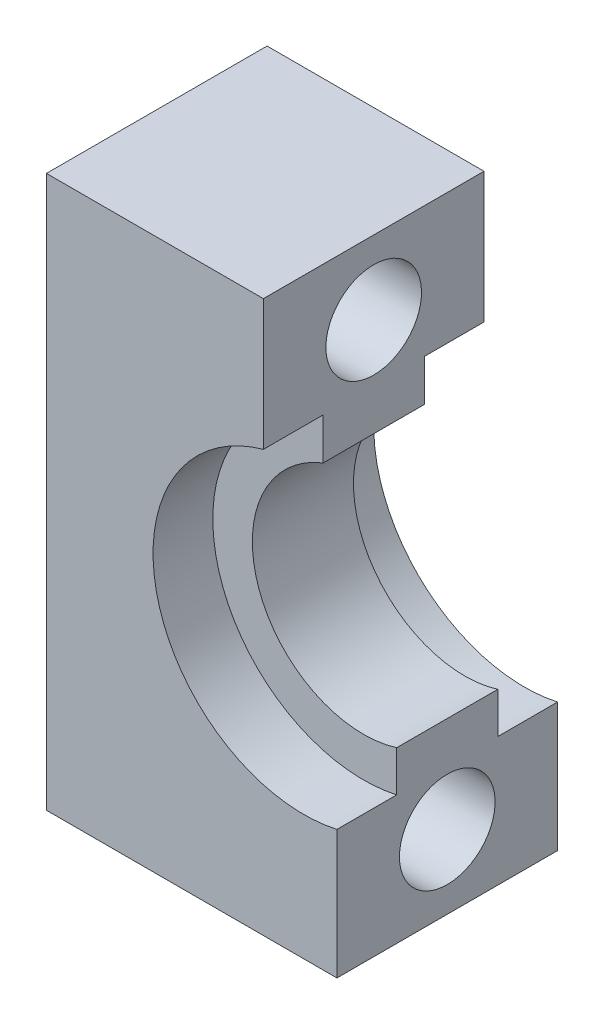
ISO-10303-21;
HEADER;
FILE_DESCRIPTION(('STEP AP214'),'2;1');
FILE_NAME('part.step','',(''),(''),'','','');
FILE_SCHEMA(('AUTOMOTIVE_DESIGN { 1 0 10303 214 1 1 1 1 }'));
ENDSEC;
DATA;
#1=APPLICATION_CONTEXT('core data for automotive mechanical design processes');
#2=APPLICATION_PROTOCOL_DEFINITION('international standard','automotive_design',2000,#1);
#3=PRODUCT_CONTEXT('',#1,'mechanical');
#4=PRODUCT('Part','Part','',(#3));
#5=PRODUCT_RELATED_PRODUCT_CATEGORY('part','',(#4));
#6=PRODUCT_DEFINITION_FORMATION('','',#4);
#7=PRODUCT_DEFINITION_CONTEXT('part definition',#1,'design');
#8=PRODUCT_DEFINITION('design','',#6,#7);
#9=PRODUCT_DEFINITION_SHAPE('','',#8);
#10=(LENGTH_UNIT() NAMED_UNIT(*) SI_UNIT(.MILLI.,.METRE.));
#11=(NAMED_UNIT(*) PLANE_ANGLE_UNIT() SI_UNIT($,.RADIAN.));
#12=(NAMED_UNIT(*) SI_UNIT($,.STERADIAN.) SOLID_ANGLE_UNIT());
#13=UNCERTAINTY_MEASURE_WITH_UNIT(LENGTH_MEASURE(1.E-05),#10,'distance_accuracy_value','');
#14=(GEOMETRIC_REPRESENTATION_CONTEXT(3) GLOBAL_UNCERTAINTY_ASSIGNED_CONTEXT((#13)) GLOBAL_UNIT_ASSIGNED_CONTEXT((#10,
#11,#12)) REPRESENTATION_CONTEXT('',''));
#15=CARTESIAN_POINT('',(0.,0.,0.));
#16=DIRECTION('',(0.,0.,1.));
#17=DIRECTION('',(1.,0.,0.));
#18=AXIS2_PLACEMENT_3D('',#15,#16,#17);
#19=CARTESIAN_POINT('',(14.,0.,6.));
#20=DIRECTION('',(0.,0.,-1.));
#21=DIRECTION('',(-1.,0.,0.));
#22=AXIS2_PLACEMENT_3D('',#19,#20,#21);
#23=CYLINDRICAL_SURFACE('',#22,8.2);
#24=CARTESIAN_POINT('',(14.,0.,-2.75));
#25=DIRECTION('',(0.,0.,1.));
#26=DIRECTION('',(1.,0.,0.));
#27=AXIS2_PLACEMENT_3D('',#24,#25,#26);
#28=CIRCLE('',#27,8.2);
#29=CARTESIAN_POINT('',(15.8,-8.,-2.75));
#30=VERTEX_POINT('',#29);
#31=CARTESIAN_POINT('',(11.8,7.8993670632526,-2.75));
#32=VERTEX_POINT('',#31);
#33=EDGE_CURVE('E48',#30,#32,#28,.F.);
#34=ORIENTED_EDGE('',*,*,#33,.F.);
#35=DIRECTION('',(0.,0.,-1.));
#36=VECTOR('',#35,1.);
#37=CARTESIAN_POINT('',(15.8,-8.,6.));
#38=LINE('',#37,#36);
#39=CARTESIAN_POINT('',(15.8,-8.,-6.));
#40=VERTEX_POINT('',#39);
#41=EDGE_CURVE('E182',#30,#40,#38,.T.);
#42=ORIENTED_EDGE('',*,*,#41,.T.);
#43=CARTESIAN_POINT('',(14.,0.,-6.));
#44=DIRECTION('',(0.,0.,-1.));
#45=DIRECTION('',(1.,0.,0.));
#46=AXIS2_PLACEMENT_3D('',#43,#44,#45);
#47=CIRCLE('',#46,8.2);
#48=CARTESIAN_POINT('',(11.8,7.8993670632526,-6.));
#49=VERTEX_POINT('',#48);
#50=EDGE_CURVE('E165',#40,#49,#47,.T.);
#51=ORIENTED_EDGE('',*,*,#50,.T.);
#52=DIRECTION('',(0.,0.,-1.));
#53=VECTOR('',#52,1.);
#54=CARTESIAN_POINT('',(11.8,7.8993670632526,6.));
#55=LINE('',#54,#53);
#56=EDGE_CURVE('E181',#32,#49,#55,.T.);
#57=ORIENTED_EDGE('',*,*,#56,.F.);
#58=EDGE_LOOP('',(#34,#42,#51,#57));
#59=FACE_BOUND('',#58,.T.);
#60=ADVANCED_FACE('F33',(#59),#23,.F.);
#61=CARTESIAN_POINT('',(0.,-15.,6.));
#62=DIRECTION('',(0.,1.,0.));
#63=DIRECTION('',(-1.,0.,0.));
#64=AXIS2_PLACEMENT_3D('',#61,#62,#63);
#65=PLANE('',#64);
#66=DIRECTION('',(1.,0.,0.));
#67=VECTOR('',#66,1.);
#68=CARTESIAN_POINT('',(0.,-15.,-6.));
#69=LINE('',#68,#67);
#70=CARTESIAN_POINT('',(0.,-15.,-6.));
#71=VERTEX_POINT('',#70);
#72=CARTESIAN_POINT('',(15.8,-15.,-6.));
#73=VERTEX_POINT('',#72);
#74=EDGE_CURVE('E144',#71,#73,#69,.T.);
#75=ORIENTED_EDGE('',*,*,#74,.T.);
#76=DIRECTION('',(0.,0.,-1.));
#77=VECTOR('',#76,1.);
#78=CARTESIAN_POINT('',(15.8,-15.,6.));
#79=LINE('',#78,#77);
#80=CARTESIAN_POINT('',(15.8,-15.,6.));
#81=VERTEX_POINT('',#80);
#82=EDGE_CURVE('E11',#81,#73,#79,.T.);
#83=ORIENTED_EDGE('',*,*,#82,.F.);
#84=DIRECTION('',(1.,0.,0.));
#85=VECTOR('',#84,1.);
#86=CARTESIAN_POINT('',(0.,-15.,6.));
#87=LINE('',#86,#85);
#88=CARTESIAN_POINT('',(0.,-15.,6.));
#89=VERTEX_POINT('',#88);
#90=EDGE_CURVE('E145',#89,#81,#87,.T.);
#91=ORIENTED_EDGE('',*,*,#90,.F.);
#92=DIRECTION('',(0.,0.,-1.));
#93=VECTOR('',#92,1.);
#94=CARTESIAN_POINT('',(0.,-15.,6.));
#95=LINE('',#94,#93);
#96=EDGE_CURVE('E159',#89,#71,#95,.T.);
#97=ORIENTED_EDGE('',*,*,#96,.T.);
#98=EDGE_LOOP('',(#75,#83,#91,#97));
#99=FACE_BOUND('',#98,.T.);
#100=ADVANCED_FACE('F35',(#99),#65,.F.);
#101=CARTESIAN_POINT('',(15.8,-15.,6.));
#102=DIRECTION('',(-1.,0.,0.));
#103=DIRECTION('',(0.,0.,1.));
#104=AXIS2_PLACEMENT_3D('',#101,#102,#103);
#105=PLANE('',#104);
#106=CARTESIAN_POINT('',(15.8,-11.,0.));
#107=DIRECTION('',(-1.,0.,0.));
#108=DIRECTION('',(0.,0.,1.));
#109=AXIS2_PLACEMENT_3D('',#106,#107,#108);
#110=CIRCLE('',#109,2.6);
#111=CARTESIAN_POINT('',(15.8,-11.,2.6));
#112=VERTEX_POINT('',#111);
#113=EDGE_CURVE('E238',#112,#112,#110,.T.);
#114=ORIENTED_EDGE('',*,*,#113,.T.);
#115=EDGE_LOOP('',(#114));
#116=FACE_BOUND('',#115,.T.);
#117=DIRECTION('',(0.,1.,0.));
#118=VECTOR('',#117,1.);
#119=CARTESIAN_POINT('',(15.8,-5.77602804702332,2.75));
#120=LINE('',#119,#118);
#121=CARTESIAN_POINT('',(15.8,-8.,2.75));
#122=VERTEX_POINT('',#121);
#123=CARTESIAN_POINT('',(15.8,-5.77602804702332,2.75));
#124=VERTEX_POINT('',#123);
#125=EDGE_CURVE('E122',#122,#124,#120,.T.);
#126=ORIENTED_EDGE('',*,*,#125,.F.);
#127=CARTESIAN_POINT('',(15.8,-8.,6.));
#128=VERTEX_POINT('',#127);
#129=EDGE_CURVE('E41',#128,#122,#38,.T.);
#130=ORIENTED_EDGE('',*,*,#129,.F.);
#131=DIRECTION('',(0.,1.,0.));
#132=VECTOR('',#131,1.);
#133=CARTESIAN_POINT('',(15.8,-15.,6.));
#134=LINE('',#133,#132);
#135=EDGE_CURVE('E148',#81,#128,#134,.T.);
#136=ORIENTED_EDGE('',*,*,#135,.F.);
#137=ORIENTED_EDGE('',*,*,#82,.T.);
#138=DIRECTION('',(0.,1.,0.));
#139=VECTOR('',#138,1.);
#140=CARTESIAN_POINT('',(15.8,-15.,-6.));
#141=LINE('',#140,#139);
#142=EDGE_CURVE('E162',#73,#40,#141,.T.);
#143=ORIENTED_EDGE('',*,*,#142,.T.);
#144=ORIENTED_EDGE('',*,*,#41,.F.);
#145=DIRECTION('',(0.,1.,0.));
#146=VECTOR('',#145,1.);
#147=CARTESIAN_POINT('',(15.8,-5.77602804702332,-2.75));
#148=LINE('',#147,#146);
#149=CARTESIAN_POINT('',(15.8,-5.77602804702332,-2.75));
#150=VERTEX_POINT('',#149);
#151=EDGE_CURVE('E131',#30,#150,#148,.T.);
#152=ORIENTED_EDGE('',*,*,#151,.T.);
#153=DIRECTION('',(0.,0.,-1.));
#154=VECTOR('',#153,1.);
#155=CARTESIAN_POINT('',(15.8,-5.77602804702332,2.75));
#156=LINE('',#155,#154);
#157=EDGE_CURVE('E136',#124,#150,#156,.T.);
#158=ORIENTED_EDGE('',*,*,#157,.F.);
#159=EDGE_LOOP('',(#126,#130,#136,#137,#143,#144,#152,#158));
#160=FACE_BOUND('',#159,.T.);
#161=ADVANCED_FACE('F187',(#116,#160),#105,.F.);
#162=ORIENTED_EDGE('',*,*,#129,.T.);
#163=CARTESIAN_POINT('',(14.,0.,2.75));
#164=DIRECTION('',(0.,0.,1.));
#165=DIRECTION('',(1.,0.,0.));
#166=AXIS2_PLACEMENT_3D('',#163,#164,#165);
#167=CIRCLE('',#166,8.2);
#168=CARTESIAN_POINT('',(11.8,7.8993670632526,2.75));
#169=VERTEX_POINT('',#168);
#170=EDGE_CURVE('E138',#122,#169,#167,.F.);
#171=ORIENTED_EDGE('',*,*,#170,.T.);
#172=CARTESIAN_POINT('',(11.8,7.8993670632526,6.));
#173=VERTEX_POINT('',#172);
#174=EDGE_CURVE('E120',#173,#169,#55,.T.);
#175=ORIENTED_EDGE('',*,*,#174,.F.);
#176=CARTESIAN_POINT('',(14.,0.,6.));
#177=DIRECTION('',(0.,0.,-1.));
#178=DIRECTION('',(1.,0.,0.));
#179=AXIS2_PLACEMENT_3D('',#176,#177,#178);
#180=CIRCLE('',#179,8.2);
#181=EDGE_CURVE('E151',#128,#173,#180,.T.);
#182=ORIENTED_EDGE('',*,*,#181,.F.);
#183=EDGE_LOOP('',(#162,#171,#175,#182));
#184=FACE_BOUND('',#183,.T.);
#185=ADVANCED_FACE('F203',(#184),#23,.F.);
#186=CARTESIAN_POINT('',(11.8,15.,6.));
#187=DIRECTION('',(-1.,0.,0.));
#188=DIRECTION('',(0.,-1.,0.));
#189=AXIS2_PLACEMENT_3D('',#186,#187,#188);
#190=PLANE('',#189);
#191=CARTESIAN_POINT('',(11.8,11.,0.));
#192=DIRECTION('',(-1.,0.,0.));
#193=DIRECTION('',(0.,-1.,0.));
#194=AXIS2_PLACEMENT_3D('',#191,#192,#193);
#195=CIRCLE('',#194,2.6);
#196=CARTESIAN_POINT('',(11.8,8.4,0.));
#197=VERTEX_POINT('',#196);
#198=EDGE_CURVE('E243',#197,#197,#195,.T.);
#199=ORIENTED_EDGE('',*,*,#198,.T.);
#200=EDGE_LOOP('',(#199));
#201=FACE_BOUND('',#200,.T.);
#202=ORIENTED_EDGE('',*,*,#174,.T.);
#203=DIRECTION('',(0.,1.,0.));
#204=VECTOR('',#203,1.);
#205=CARTESIAN_POINT('',(11.8,8.2103593100424,2.75));
#206=LINE('',#205,#204);
#207=CARTESIAN_POINT('',(11.8,5.63582292127778,2.75));
#208=VERTEX_POINT('',#207);
#209=EDGE_CURVE('E111',#208,#169,#206,.T.);
#210=ORIENTED_EDGE('',*,*,#209,.F.);
#211=DIRECTION('',(0.,0.,-1.));
#212=VECTOR('',#211,1.);
#213=CARTESIAN_POINT('',(11.8,5.63582292127778,2.75));
#214=LINE('',#213,#212);
#215=CARTESIAN_POINT('',(11.8,5.63582292127778,-2.75));
#216=VERTEX_POINT('',#215);
#217=EDGE_CURVE('E116',#208,#216,#214,.T.);
#218=ORIENTED_EDGE('',*,*,#217,.T.);
#219=DIRECTION('',(0.,1.,0.));
#220=VECTOR('',#219,1.);
#221=CARTESIAN_POINT('',(11.8,8.2103593100424,-2.75));
#222=LINE('',#221,#220);
#223=EDGE_CURVE('E207',#216,#32,#222,.T.);
#224=ORIENTED_EDGE('',*,*,#223,.T.);
#225=ORIENTED_EDGE('',*,*,#56,.T.);
#226=DIRECTION('',(0.,1.,0.));
#227=VECTOR('',#226,1.);
#228=CARTESIAN_POINT('',(11.8,15.,-6.));
#229=LINE('',#228,#227);
#230=CARTESIAN_POINT('',(11.8,15.,-6.));
#231=VERTEX_POINT('',#230);
#232=EDGE_CURVE('E168',#49,#231,#229,.T.);
#233=ORIENTED_EDGE('',*,*,#232,.T.);
#234=DIRECTION('',(0.,0.,-1.));
#235=VECTOR('',#234,1.);
#236=CARTESIAN_POINT('',(11.8,15.,6.));
#237=LINE('',#236,#235);
#238=CARTESIAN_POINT('',(11.8,15.,6.));
#239=VERTEX_POINT('',#238);
#240=EDGE_CURVE('E178',#239,#231,#237,.T.);
#241=ORIENTED_EDGE('',*,*,#240,.F.);
#242=DIRECTION('',(0.,1.,0.));
#243=VECTOR('',#242,1.);
#244=CARTESIAN_POINT('',(11.8,15.,6.));
#245=LINE('',#244,#243);
#246=EDGE_CURVE('E153',#173,#239,#245,.T.);
#247=ORIENTED_EDGE('',*,*,#246,.F.);
#248=EDGE_LOOP('',(#202,#210,#218,#224,#225,#233,#241,#247));
#249=FACE_BOUND('',#248,.T.);
#250=ADVANCED_FACE('F113',(#201,#249),#190,.F.);
#251=CARTESIAN_POINT('',(0.,15.,6.));
#252=DIRECTION('',(0.,-1.,0.));
#253=DIRECTION('',(0.,0.,-1.));
#254=AXIS2_PLACEMENT_3D('',#251,#252,#253);
#255=PLANE('',#254);
#256=DIRECTION('',(-1.,0.,0.));
#257=VECTOR('',#256,1.);
#258=CARTESIAN_POINT('',(0.,15.,-6.));
#259=LINE('',#258,#257);
#260=CARTESIAN_POINT('',(0.,15.,-6.));
#261=VERTEX_POINT('',#260);
#262=EDGE_CURVE('E170',#231,#261,#259,.T.);
#263=ORIENTED_EDGE('',*,*,#262,.T.);
#264=DIRECTION('',(0.,0.,-1.));
#265=VECTOR('',#264,1.);
#266=CARTESIAN_POINT('',(0.,15.,6.));
#267=LINE('',#266,#265);
#268=CARTESIAN_POINT('',(0.,15.,6.));
#269=VERTEX_POINT('',#268);
#270=EDGE_CURVE('E175',#269,#261,#267,.T.);
#271=ORIENTED_EDGE('',*,*,#270,.F.);
#272=DIRECTION('',(-1.,0.,0.));
#273=VECTOR('',#272,1.);
#274=CARTESIAN_POINT('',(0.,15.,6.));
#275=LINE('',#274,#273);
#276=EDGE_CURVE('E155',#239,#269,#275,.T.);
#277=ORIENTED_EDGE('',*,*,#276,.F.);
#278=ORIENTED_EDGE('',*,*,#240,.T.);
#279=EDGE_LOOP('',(#263,#271,#277,#278));
#280=FACE_BOUND('',#279,.T.);
#281=ADVANCED_FACE('F197',(#280),#255,.F.);
#282=CARTESIAN_POINT('',(0.,-15.,6.));
#283=DIRECTION('',(1.,0.,0.));
#284=DIRECTION('',(0.,0.,-1.));
#285=AXIS2_PLACEMENT_3D('',#282,#283,#284);
#286=PLANE('',#285);
#287=CARTESIAN_POINT('',(0.,-11.,0.));
#288=DIRECTION('',(1.,0.,0.));
#289=DIRECTION('',(0.,0.,-1.));
#290=AXIS2_PLACEMENT_3D('',#287,#288,#289);
#291=CIRCLE('',#290,2.6);
#292=CARTESIAN_POINT('',(0.,-11.,-2.6));
#293=VERTEX_POINT('',#292);
#294=EDGE_CURVE('E240',#293,#293,#291,.T.);
#295=ORIENTED_EDGE('',*,*,#294,.T.);
#296=EDGE_LOOP('',(#295));
#297=FACE_BOUND('',#296,.T.);
#298=CARTESIAN_POINT('',(0.,11.,0.));
#299=DIRECTION('',(1.,0.,0.));
#300=DIRECTION('',(0.,0.,-1.));
#301=AXIS2_PLACEMENT_3D('',#298,#299,#300);
#302=CIRCLE('',#301,2.6);
#303=CARTESIAN_POINT('',(0.,11.,-2.6));
#304=VERTEX_POINT('',#303);
#305=EDGE_CURVE('E208',#304,#304,#302,.T.);
#306=ORIENTED_EDGE('',*,*,#305,.T.);
#307=EDGE_LOOP('',(#306));
#308=FACE_BOUND('',#307,.T.);
#309=DIRECTION('',(0.,-1.,0.));
#310=VECTOR('',#309,1.);
#311=CARTESIAN_POINT('',(0.,-15.,-6.));
#312=LINE('',#311,#310);
#313=EDGE_CURVE('E149',#261,#71,#312,.T.);
#314=ORIENTED_EDGE('',*,*,#313,.T.);
#315=ORIENTED_EDGE('',*,*,#96,.F.);
#316=DIRECTION('',(0.,-1.,0.));
#317=VECTOR('',#316,1.);
#318=CARTESIAN_POINT('',(0.,-15.,6.));
#319=LINE('',#318,#317);
#320=EDGE_CURVE('E157',#269,#89,#319,.T.);
#321=ORIENTED_EDGE('',*,*,#320,.F.);
#322=ORIENTED_EDGE('',*,*,#270,.T.);
#323=EDGE_LOOP('',(#314,#315,#321,#322));
#324=FACE_BOUND('',#323,.T.);
#325=ADVANCED_FACE('F262',(#297,#308,#324),#286,.F.);
#326=CARTESIAN_POINT('',(14.,0.,6.));
#327=DIRECTION('',(0.,0.,1.));
#328=DIRECTION('',(1.,0.,0.));
#329=AXIS2_PLACEMENT_3D('',#326,#327,#328);
#330=PLANE('',#329);
#331=ORIENTED_EDGE('',*,*,#90,.T.);
#332=ORIENTED_EDGE('',*,*,#135,.T.);
#333=ORIENTED_EDGE('',*,*,#181,.T.);
#334=ORIENTED_EDGE('',*,*,#246,.T.);
#335=ORIENTED_EDGE('',*,*,#276,.T.);
#336=ORIENTED_EDGE('',*,*,#320,.T.);
#337=EDGE_LOOP('',(#331,#332,#333,#334,#335,#336));
#338=FACE_BOUND('',#337,.T.);
#339=ADVANCED_FACE('F201',(#338),#330,.T.);
#340=CARTESIAN_POINT('',(14.,0.,-6.));
#341=DIRECTION('',(0.,0.,1.));
#342=DIRECTION('',(1.,0.,0.));
#343=AXIS2_PLACEMENT_3D('',#340,#341,#342);
#344=PLANE('',#343);
#345=ORIENTED_EDGE('',*,*,#74,.F.);
#346=ORIENTED_EDGE('',*,*,#313,.F.);
#347=ORIENTED_EDGE('',*,*,#262,.F.);
#348=ORIENTED_EDGE('',*,*,#232,.F.);
#349=ORIENTED_EDGE('',*,*,#50,.F.);
#350=ORIENTED_EDGE('',*,*,#142,.F.);
#351=EDGE_LOOP('',(#345,#346,#347,#348,#349,#350));
#352=FACE_BOUND('',#351,.T.);
#353=ADVANCED_FACE('F191',(#352),#344,.F.);
#354=CARTESIAN_POINT('',(14.,0.,2.75));
#355=DIRECTION('',(0.,0.,1.));
#356=DIRECTION('',(1.,0.,0.));
#357=AXIS2_PLACEMENT_3D('',#354,#355,#356);
#358=PLANE('',#357);
#359=ORIENTED_EDGE('',*,*,#170,.F.);
#360=ORIENTED_EDGE('',*,*,#125,.T.);
#361=CARTESIAN_POINT('',(14.,0.,2.75));
#362=DIRECTION('',(0.,0.,-1.));
#363=DIRECTION('',(1.,0.,0.));
#364=AXIS2_PLACEMENT_3D('',#361,#362,#363);
#365=CIRCLE('',#364,6.05);
#366=EDGE_CURVE('E123',#124,#208,#365,.T.);
#367=ORIENTED_EDGE('',*,*,#366,.T.);
#368=ORIENTED_EDGE('',*,*,#209,.T.);
#369=EDGE_LOOP('',(#359,#360,#367,#368));
#370=FACE_BOUND('',#369,.T.);
#371=ADVANCED_FACE('F126',(#370),#358,.T.);
#372=CARTESIAN_POINT('',(14.,0.,-2.75));
#373=DIRECTION('',(0.,0.,1.));
#374=DIRECTION('',(1.,0.,0.));
#375=AXIS2_PLACEMENT_3D('',#372,#373,#374);
#376=PLANE('',#375);
#377=ORIENTED_EDGE('',*,*,#151,.F.);
#378=ORIENTED_EDGE('',*,*,#33,.T.);
#379=ORIENTED_EDGE('',*,*,#223,.F.);
#380=CARTESIAN_POINT('',(14.,0.,-2.75));
#381=DIRECTION('',(0.,0.,-1.));
#382=DIRECTION('',(1.,0.,0.));
#383=AXIS2_PLACEMENT_3D('',#380,#381,#382);
#384=CIRCLE('',#383,6.05);
#385=EDGE_CURVE('E135',#150,#216,#384,.T.);
#386=ORIENTED_EDGE('',*,*,#385,.F.);
#387=EDGE_LOOP('',(#377,#378,#379,#386));
#388=FACE_BOUND('',#387,.T.);
#389=ADVANCED_FACE('F210',(#388),#376,.F.);
#390=CARTESIAN_POINT('',(14.,0.,2.75));
#391=DIRECTION('',(0.,0.,-1.));
#392=DIRECTION('',(-1.,0.,0.));
#393=AXIS2_PLACEMENT_3D('',#390,#391,#392);
#394=CYLINDRICAL_SURFACE('',#393,6.05);
#395=ORIENTED_EDGE('',*,*,#385,.T.);
#396=ORIENTED_EDGE('',*,*,#217,.F.);
#397=ORIENTED_EDGE('',*,*,#366,.F.);
#398=ORIENTED_EDGE('',*,*,#157,.T.);
#399=EDGE_LOOP('',(#395,#396,#397,#398));
#400=FACE_BOUND('',#399,.T.);
#401=ADVANCED_FACE('F133',(#400),#394,.F.);
#402=CARTESIAN_POINT('',(15.801,11.,0.));
#403=DIRECTION('',(-1.,0.,0.));
#404=DIRECTION('',(0.,0.,1.));
#405=AXIS2_PLACEMENT_3D('',#402,#403,#404);
#406=CYLINDRICAL_SURFACE('',#405,2.6);
#407=ORIENTED_EDGE('',*,*,#305,.F.);
#408=EDGE_LOOP('',(#407));
#409=FACE_BOUND('',#408,.T.);
#410=ORIENTED_EDGE('',*,*,#198,.F.);
#411=EDGE_LOOP('',(#410));
#412=FACE_BOUND('',#411,.T.);
#413=ADVANCED_FACE('F217',(#409,#412),#406,.F.);
#414=CARTESIAN_POINT('',(15.801,-11.,0.));
#415=DIRECTION('',(-1.,0.,0.));
#416=DIRECTION('',(0.,0.,1.));
#417=AXIS2_PLACEMENT_3D('',#414,#415,#416);
#418=CYLINDRICAL_SURFACE('',#417,2.6);
#419=ORIENTED_EDGE('',*,*,#294,.F.);
#420=EDGE_LOOP('',(#419));
#421=FACE_BOUND('',#420,.T.);
#422=ORIENTED_EDGE('',*,*,#113,.F.);
#423=EDGE_LOOP('',(#422));
#424=FACE_BOUND('',#423,.T.);
#425=ADVANCED_FACE('F252',(#421,#424),#418,.F.);
#426=CLOSED_SHELL('',(#60,#100,#161,#185,#250,#281,#325,#339,#353,#371,#389,#401,#413,#425));
#427=MANIFOLD_SOLID_BREP('B2',#426);
#428=ADVANCED_BREP_SHAPE_REPRESENTATION('',(#18,#427),#14);
#429=SHAPE_DEFINITION_REPRESENTATION(#9,#428);
ENDSEC;
END-ISO-10303-21;
